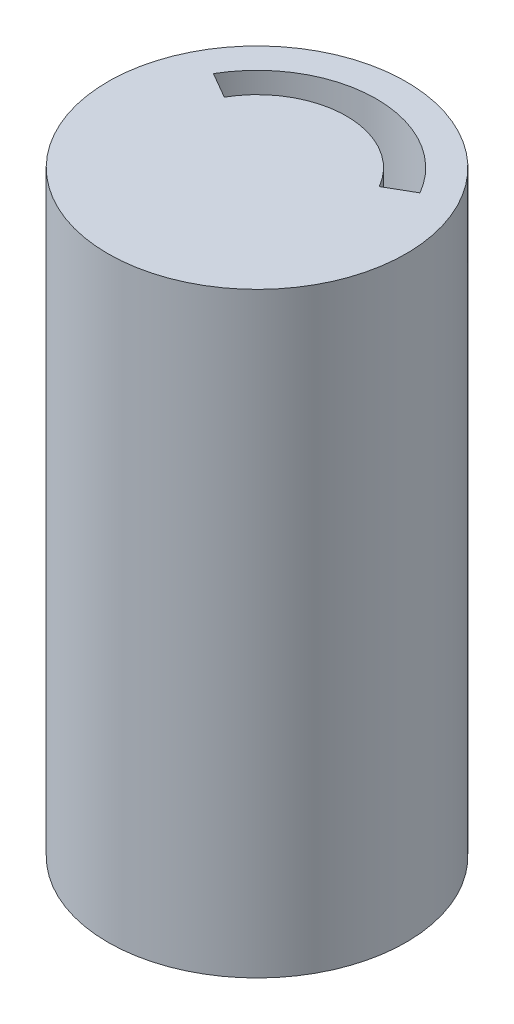
ISO-10303-21;
HEADER;
FILE_DESCRIPTION(('STEP AP214'),'2;1');
FILE_NAME('part.step','',(''),(''),'','','');
FILE_SCHEMA(('AUTOMOTIVE_DESIGN { 1 0 10303 214 1 1 1 1 }'));
ENDSEC;
DATA;
#1=APPLICATION_CONTEXT('core data for automotive mechanical design processes');
#2=APPLICATION_PROTOCOL_DEFINITION('international standard','automotive_design',2000,#1);
#3=PRODUCT_CONTEXT('',#1,'mechanical');
#4=PRODUCT('Part','Part','',(#3));
#5=PRODUCT_RELATED_PRODUCT_CATEGORY('part','',(#4));
#6=PRODUCT_DEFINITION_FORMATION('','',#4);
#7=PRODUCT_DEFINITION_CONTEXT('part definition',#1,'design');
#8=PRODUCT_DEFINITION('design','',#6,#7);
#9=PRODUCT_DEFINITION_SHAPE('','',#8);
#10=(LENGTH_UNIT() NAMED_UNIT(*) SI_UNIT(.MILLI.,.METRE.));
#11=(NAMED_UNIT(*) PLANE_ANGLE_UNIT() SI_UNIT($,.RADIAN.));
#12=(NAMED_UNIT(*) SI_UNIT($,.STERADIAN.) SOLID_ANGLE_UNIT());
#13=UNCERTAINTY_MEASURE_WITH_UNIT(LENGTH_MEASURE(1.E-05),#10,'distance_accuracy_value','');
#14=(GEOMETRIC_REPRESENTATION_CONTEXT(3) GLOBAL_UNCERTAINTY_ASSIGNED_CONTEXT((#13)) GLOBAL_UNIT_ASSIGNED_CONTEXT((#10,
#11,#12)) REPRESENTATION_CONTEXT('',''));
#15=CARTESIAN_POINT('',(0.,0.,0.));
#16=DIRECTION('',(0.,0.,1.));
#17=DIRECTION('',(1.,0.,0.));
#18=AXIS2_PLACEMENT_3D('',#15,#16,#17);
#19=CARTESIAN_POINT('',(0.,20.,0.));
#20=DIRECTION('',(0.,1.,0.));
#21=DIRECTION('',(0.,0.,1.));
#22=AXIS2_PLACEMENT_3D('',#19,#20,#21);
#23=PLANE('',#22);
#24=CARTESIAN_POINT('',(0.,20.,0.));
#25=DIRECTION('',(0.,1.,0.));
#26=DIRECTION('',(0.,0.,1.));
#27=AXIS2_PLACEMENT_3D('',#24,#25,#26);
#28=CIRCLE('',#27,5.);
#29=CARTESIAN_POINT('',(0.,20.,5.));
#30=VERTEX_POINT('',#29);
#31=EDGE_CURVE('E11',#30,#30,#28,.T.);
#32=ORIENTED_EDGE('',*,*,#31,.T.);
#33=EDGE_LOOP('',(#32));
#34=FACE_BOUND('',#33,.T.);
#35=DIRECTION('',(0.86602540378444,0.,-0.499999999999998));
#36=VECTOR('',#35,1.);
#37=CARTESIAN_POINT('',(2.59807621135332,20.,-1.49999999999999));
#38=LINE('',#37,#36);
#39=CARTESIAN_POINT('',(2.59807621135332,20.,-1.49999999999999));
#40=VERTEX_POINT('',#39);
#41=CARTESIAN_POINT('',(3.46410161513776,20.,-1.99999999999999));
#42=VERTEX_POINT('',#41);
#43=EDGE_CURVE('E91',#40,#42,#38,.T.);
#44=ORIENTED_EDGE('',*,*,#43,.F.);
#45=CARTESIAN_POINT('',(0.,20.,0.));
#46=DIRECTION('',(0.,-1.,0.));
#47=DIRECTION('',(0.,0.,-1.));
#48=AXIS2_PLACEMENT_3D('',#45,#46,#47);
#49=CIRCLE('',#48,3.);
#50=CARTESIAN_POINT('',(-2.59807621135332,20.,-1.49999999999999));
#51=VERTEX_POINT('',#50);
#52=EDGE_CURVE('E83',#51,#40,#49,.T.);
#53=ORIENTED_EDGE('',*,*,#52,.F.);
#54=DIRECTION('',(0.86602540378444,0.,0.499999999999998));
#55=VECTOR('',#54,1.);
#56=CARTESIAN_POINT('',(-3.46410161513776,20.,-1.99999999999999));
#57=LINE('',#56,#55);
#58=CARTESIAN_POINT('',(-3.46410161513776,20.,-1.99999999999999));
#59=VERTEX_POINT('',#58);
#60=EDGE_CURVE('E104',#59,#51,#57,.T.);
#61=ORIENTED_EDGE('',*,*,#60,.F.);
#62=CARTESIAN_POINT('',(0.,20.,0.));
#63=DIRECTION('',(0.,1.,0.));
#64=DIRECTION('',(0.,0.,-1.));
#65=AXIS2_PLACEMENT_3D('',#62,#63,#64);
#66=CIRCLE('',#65,4.);
#67=EDGE_CURVE('E102',#42,#59,#66,.T.);
#68=ORIENTED_EDGE('',*,*,#67,.F.);
#69=EDGE_LOOP('',(#44,#53,#61,#68));
#70=FACE_BOUND('',#69,.T.);
#71=ADVANCED_FACE('F42',(#34,#70),#23,.T.);
#72=CARTESIAN_POINT('',(0.,0.,0.));
#73=DIRECTION('',(0.,1.,0.));
#74=DIRECTION('',(0.,0.,1.));
#75=AXIS2_PLACEMENT_3D('',#72,#73,#74);
#76=PLANE('',#75);
#77=CARTESIAN_POINT('',(0.,0.,0.));
#78=DIRECTION('',(0.,-1.,0.));
#79=DIRECTION('',(0.,0.,-1.));
#80=AXIS2_PLACEMENT_3D('',#77,#78,#79);
#81=CIRCLE('',#80,0.75);
#82=CARTESIAN_POINT('',(0.,0.,-0.75));
#83=VERTEX_POINT('',#82);
#84=EDGE_CURVE('E182',#83,#83,#81,.T.);
#85=ORIENTED_EDGE('',*,*,#84,.F.);
#86=EDGE_LOOP('',(#85));
#87=FACE_BOUND('',#86,.T.);
#88=CARTESIAN_POINT('',(0.,0.,0.));
#89=DIRECTION('',(0.,1.,0.));
#90=DIRECTION('',(0.,0.,1.));
#91=AXIS2_PLACEMENT_3D('',#88,#89,#90);
#92=CIRCLE('',#91,5.);
#93=CARTESIAN_POINT('',(0.,0.,5.));
#94=VERTEX_POINT('',#93);
#95=EDGE_CURVE('E46',#94,#94,#92,.T.);
#96=ORIENTED_EDGE('',*,*,#95,.F.);
#97=EDGE_LOOP('',(#96));
#98=FACE_BOUND('',#97,.T.);
#99=CARTESIAN_POINT('',(0.,0.,0.));
#100=DIRECTION('',(0.,-1.,0.));
#101=DIRECTION('',(0.,0.,-1.));
#102=AXIS2_PLACEMENT_3D('',#99,#100,#101);
#103=CIRCLE('',#102,3.);
#104=CARTESIAN_POINT('',(-2.59807621135332,0.,-1.49999999999999));
#105=VERTEX_POINT('',#104);
#106=CARTESIAN_POINT('',(2.59807621135332,0.,-1.49999999999999));
#107=VERTEX_POINT('',#106);
#108=EDGE_CURVE('E65',#105,#107,#103,.T.);
#109=ORIENTED_EDGE('',*,*,#108,.T.);
#110=DIRECTION('',(0.86602540378444,0.,-0.499999999999998));
#111=VECTOR('',#110,1.);
#112=CARTESIAN_POINT('',(2.59807621135332,0.,-1.49999999999999));
#113=LINE('',#112,#111);
#114=CARTESIAN_POINT('',(3.46410161513776,0.,-1.99999999999999));
#115=VERTEX_POINT('',#114);
#116=EDGE_CURVE('E98',#107,#115,#113,.T.);
#117=ORIENTED_EDGE('',*,*,#116,.T.);
#118=CARTESIAN_POINT('',(0.,0.,0.));
#119=DIRECTION('',(0.,1.,0.));
#120=DIRECTION('',(0.,0.,-1.));
#121=AXIS2_PLACEMENT_3D('',#118,#119,#120);
#122=CIRCLE('',#121,4.);
#123=CARTESIAN_POINT('',(-3.46410161513776,0.,-1.99999999999999));
#124=VERTEX_POINT('',#123);
#125=EDGE_CURVE('E112',#115,#124,#122,.T.);
#126=ORIENTED_EDGE('',*,*,#125,.T.);
#127=DIRECTION('',(0.86602540378444,0.,0.499999999999998));
#128=VECTOR('',#127,1.);
#129=CARTESIAN_POINT('',(-3.46410161513776,0.,-1.99999999999999));
#130=LINE('',#129,#128);
#131=EDGE_CURVE('E92',#124,#105,#130,.T.);
#132=ORIENTED_EDGE('',*,*,#131,.T.);
#133=EDGE_LOOP('',(#109,#117,#126,#132));
#134=FACE_BOUND('',#133,.T.);
#135=ADVANCED_FACE('F123',(#87,#98,#134),#76,.F.);
#136=CARTESIAN_POINT('',(0.,20.,0.));
#137=DIRECTION('',(0.,-1.,0.));
#138=DIRECTION('',(0.,0.,-1.));
#139=AXIS2_PLACEMENT_3D('',#136,#137,#138);
#140=CYLINDRICAL_SURFACE('',#139,5.);
#141=ORIENTED_EDGE('',*,*,#31,.F.);
#142=EDGE_LOOP('',(#141));
#143=FACE_BOUND('',#142,.T.);
#144=ORIENTED_EDGE('',*,*,#95,.T.);
#145=EDGE_LOOP('',(#144));
#146=FACE_BOUND('',#145,.T.);
#147=ADVANCED_FACE('F44',(#143,#146),#140,.T.);
#148=CARTESIAN_POINT('',(0.,20.,0.));
#149=DIRECTION('',(0.,-1.,0.));
#150=DIRECTION('',(0.,0.,-1.));
#151=AXIS2_PLACEMENT_3D('',#148,#149,#150);
#152=CYLINDRICAL_SURFACE('',#151,3.);
#153=ORIENTED_EDGE('',*,*,#108,.F.);
#154=DIRECTION('',(0.,-1.,0.));
#155=VECTOR('',#154,1.);
#156=CARTESIAN_POINT('',(-2.59807621135332,20.,-1.49999999999999));
#157=LINE('',#156,#155);
#158=EDGE_CURVE('E87',#51,#105,#157,.T.);
#159=ORIENTED_EDGE('',*,*,#158,.F.);
#160=ORIENTED_EDGE('',*,*,#52,.T.);
#161=DIRECTION('',(0.,-1.,0.));
#162=VECTOR('',#161,1.);
#163=CARTESIAN_POINT('',(2.59807621135332,20.,-1.49999999999999));
#164=LINE('',#163,#162);
#165=EDGE_CURVE('E86',#40,#107,#164,.T.);
#166=ORIENTED_EDGE('',*,*,#165,.T.);
#167=EDGE_LOOP('',(#153,#159,#160,#166));
#168=FACE_BOUND('',#167,.T.);
#169=ADVANCED_FACE('F85',(#168),#152,.T.);
#170=CARTESIAN_POINT('',(2.59807621135332,20.,-1.49999999999999));
#171=DIRECTION('',(-0.499999999999998,0.,-0.86602540378444));
#172=DIRECTION('',(-0.86602540378444,0.,0.499999999999998));
#173=AXIS2_PLACEMENT_3D('',#170,#171,#172);
#174=PLANE('',#173);
#175=ORIENTED_EDGE('',*,*,#116,.F.);
#176=ORIENTED_EDGE('',*,*,#165,.F.);
#177=ORIENTED_EDGE('',*,*,#43,.T.);
#178=DIRECTION('',(0.,-1.,0.));
#179=VECTOR('',#178,1.);
#180=CARTESIAN_POINT('',(3.46410161513776,20.,-1.99999999999999));
#181=LINE('',#180,#179);
#182=EDGE_CURVE('E99',#42,#115,#181,.T.);
#183=ORIENTED_EDGE('',*,*,#182,.T.);
#184=EDGE_LOOP('',(#175,#176,#177,#183));
#185=FACE_BOUND('',#184,.T.);
#186=ADVANCED_FACE('F95',(#185),#174,.T.);
#187=CARTESIAN_POINT('',(0.,20.,0.));
#188=DIRECTION('',(0.,-1.,0.));
#189=DIRECTION('',(0.,0.,-1.));
#190=AXIS2_PLACEMENT_3D('',#187,#188,#189);
#191=CYLINDRICAL_SURFACE('',#190,4.);
#192=ORIENTED_EDGE('',*,*,#125,.F.);
#193=ORIENTED_EDGE('',*,*,#182,.F.);
#194=ORIENTED_EDGE('',*,*,#67,.T.);
#195=DIRECTION('',(0.,-1.,0.));
#196=VECTOR('',#195,1.);
#197=CARTESIAN_POINT('',(-3.46410161513776,20.,-1.99999999999999));
#198=LINE('',#197,#196);
#199=EDGE_CURVE('E57',#59,#124,#198,.T.);
#200=ORIENTED_EDGE('',*,*,#199,.T.);
#201=EDGE_LOOP('',(#192,#193,#194,#200));
#202=FACE_BOUND('',#201,.T.);
#203=ADVANCED_FACE('F121',(#202),#191,.F.);
#204=CARTESIAN_POINT('',(-3.46410161513776,20.,-1.99999999999999));
#205=DIRECTION('',(0.499999999999998,0.,-0.86602540378444));
#206=DIRECTION('',(-0.86602540378444,0.,-0.499999999999998));
#207=AXIS2_PLACEMENT_3D('',#204,#205,#206);
#208=PLANE('',#207);
#209=ORIENTED_EDGE('',*,*,#131,.F.);
#210=ORIENTED_EDGE('',*,*,#199,.F.);
#211=ORIENTED_EDGE('',*,*,#60,.T.);
#212=ORIENTED_EDGE('',*,*,#158,.T.);
#213=EDGE_LOOP('',(#209,#210,#211,#212));
#214=FACE_BOUND('',#213,.T.);
#215=ADVANCED_FACE('F124',(#214),#208,.T.);
#216=CARTESIAN_POINT('',(0.,15.,0.));
#217=DIRECTION('',(0.,-1.,0.));
#218=DIRECTION('',(0.,0.,-1.));
#219=AXIS2_PLACEMENT_3D('',#216,#217,#218);
#220=CYLINDRICAL_SURFACE('',#219,0.75);
#221=CARTESIAN_POINT('',(0.,15.,0.));
#222=DIRECTION('',(0.,-1.,0.));
#223=DIRECTION('',(0.,0.,-1.));
#224=AXIS2_PLACEMENT_3D('',#221,#222,#223);
#225=CIRCLE('',#224,0.75);
#226=CARTESIAN_POINT('',(0.,15.,-0.75));
#227=VERTEX_POINT('',#226);
#228=EDGE_CURVE('E110',#227,#227,#225,.T.);
#229=ORIENTED_EDGE('',*,*,#228,.F.);
#230=EDGE_LOOP('',(#229));
#231=FACE_BOUND('',#230,.T.);
#232=ORIENTED_EDGE('',*,*,#84,.T.);
#233=EDGE_LOOP('',(#232));
#234=FACE_BOUND('',#233,.T.);
#235=ADVANCED_FACE('F126',(#231,#234),#220,.F.);
#236=CARTESIAN_POINT('',(0.,15.,0.));
#237=DIRECTION('',(0.,-1.,0.));
#238=DIRECTION('',(0.,0.,-1.));
#239=AXIS2_PLACEMENT_3D('',#236,#237,#238);
#240=PLANE('',#239);
#241=ORIENTED_EDGE('',*,*,#228,.T.);
#242=EDGE_LOOP('',(#241));
#243=FACE_BOUND('',#242,.T.);
#244=ADVANCED_FACE('F133',(#243),#240,.T.);
#245=CLOSED_SHELL('',(#71,#135,#147,#169,#186,#203,#215,#235,#244));
#246=MANIFOLD_SOLID_BREP('B2',#245);
#247=ADVANCED_BREP_SHAPE_REPRESENTATION('',(#18,#246),#14);
#248=SHAPE_DEFINITION_REPRESENTATION(#9,#247);
ENDSEC;
END-ISO-10303-21;
